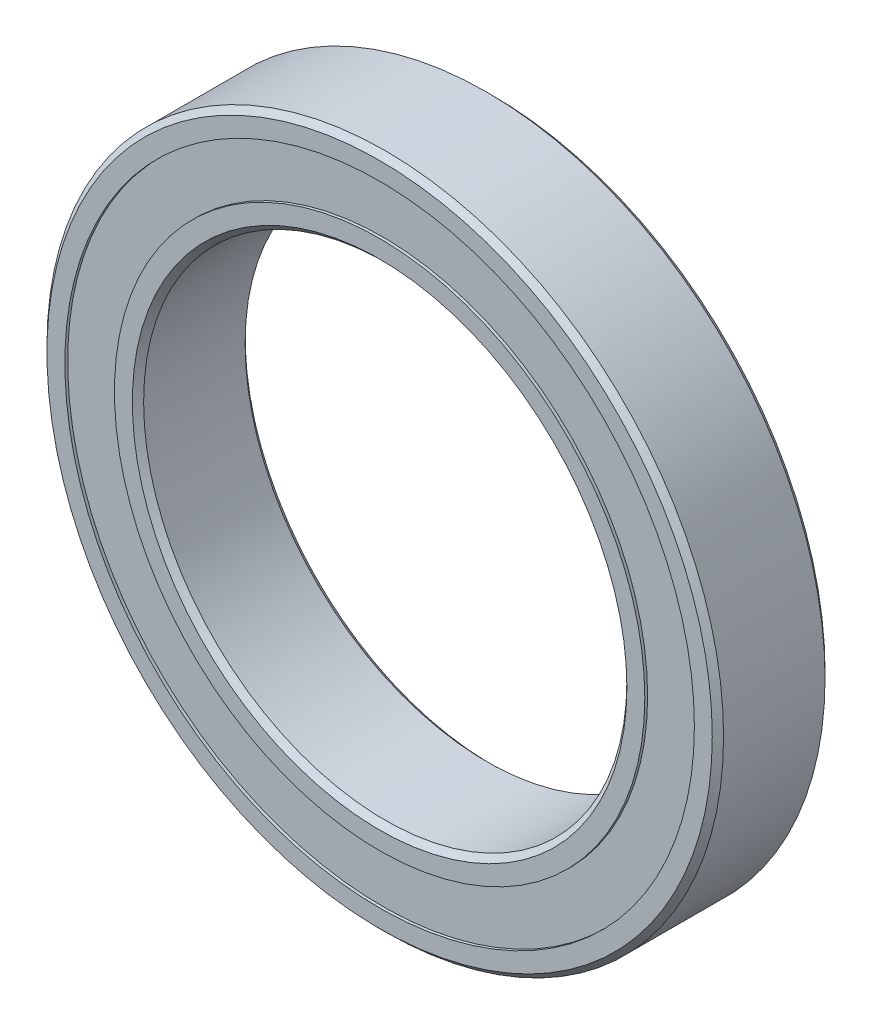
ISO-10303-21;
HEADER;
FILE_DESCRIPTION(('STEP AP214'),'2;1');
FILE_NAME('part.step','',(''),(''),'','','');
FILE_SCHEMA(('AUTOMOTIVE_DESIGN { 1 0 10303 214 1 1 1 1 }'));
ENDSEC;
DATA;
#1=APPLICATION_CONTEXT('core data for automotive mechanical design processes');
#2=APPLICATION_PROTOCOL_DEFINITION('international standard','automotive_design',2000,#1);
#3=PRODUCT_CONTEXT('',#1,'mechanical');
#4=PRODUCT('Part','Part','',(#3));
#5=PRODUCT_RELATED_PRODUCT_CATEGORY('part','',(#4));
#6=PRODUCT_DEFINITION_FORMATION('','',#4);
#7=PRODUCT_DEFINITION_CONTEXT('part definition',#1,'design');
#8=PRODUCT_DEFINITION('design','',#6,#7);
#9=PRODUCT_DEFINITION_SHAPE('','',#8);
#10=(LENGTH_UNIT() NAMED_UNIT(*) SI_UNIT(.MILLI.,.METRE.));
#11=(NAMED_UNIT(*) PLANE_ANGLE_UNIT() SI_UNIT($,.RADIAN.));
#12=(NAMED_UNIT(*) SI_UNIT($,.STERADIAN.) SOLID_ANGLE_UNIT());
#13=UNCERTAINTY_MEASURE_WITH_UNIT(LENGTH_MEASURE(1.E-05),#10,'distance_accuracy_value','');
#14=(GEOMETRIC_REPRESENTATION_CONTEXT(3) GLOBAL_UNCERTAINTY_ASSIGNED_CONTEXT((#13)) GLOBAL_UNIT_ASSIGNED_CONTEXT((#10,
#11,#12)) REPRESENTATION_CONTEXT('',''));
#15=CARTESIAN_POINT('',(0.,0.,0.));
#16=DIRECTION('',(0.,0.,1.));
#17=DIRECTION('',(1.,0.,0.));
#18=AXIS2_PLACEMENT_3D('',#15,#16,#17);
#19=CARTESIAN_POINT('',(0.,19.5384615384615,-3.32500000000001));
#20=DIRECTION('',(0.,0.,1.));
#21=DIRECTION('',(1.,0.,0.));
#22=AXIS2_PLACEMENT_3D('',#19,#20,#21);
#23=PLANE('',#22);
#24=CARTESIAN_POINT('',(0.,0.,-3.32500000000001));
#25=DIRECTION('',(0.,0.,1.));
#26=DIRECTION('',(1.,0.,0.));
#27=AXIS2_PLACEMENT_3D('',#24,#25,#26);
#28=CIRCLE('',#27,19.5384615384615);
#29=CARTESIAN_POINT('',(19.5384615384615,0.,-3.32500000000001));
#30=VERTEX_POINT('',#29);
#31=EDGE_CURVE('E55',#30,#30,#28,.T.);
#32=ORIENTED_EDGE('',*,*,#31,.F.);
#33=EDGE_LOOP('',(#32));
#34=FACE_BOUND('',#33,.T.);
#35=CARTESIAN_POINT('',(0.,0.,-3.32500000000001));
#36=DIRECTION('',(0.,0.,1.));
#37=DIRECTION('',(1.,0.,0.));
#38=AXIS2_PLACEMENT_3D('',#35,#36,#37);
#39=CIRCLE('',#38,16.4615384615385);
#40=CARTESIAN_POINT('',(16.4615384615385,0.,-3.32500000000001));
#41=VERTEX_POINT('',#40);
#42=EDGE_CURVE('E11',#41,#41,#39,.T.);
#43=ORIENTED_EDGE('',*,*,#42,.T.);
#44=EDGE_LOOP('',(#43));
#45=FACE_BOUND('',#44,.T.);
#46=ADVANCED_FACE('F41',(#34,#45),#23,.F.);
#47=CARTESIAN_POINT('',(0.,0.,3.5));
#48=DIRECTION('',(0.,0.,1.));
#49=DIRECTION('',(1.,0.,0.));
#50=AXIS2_PLACEMENT_3D('',#47,#48,#49);
#51=CYLINDRICAL_SURFACE('',#50,16.4615384615385);
#52=ORIENTED_EDGE('',*,*,#42,.F.);
#53=EDGE_LOOP('',(#52));
#54=FACE_BOUND('',#53,.T.);
#55=CARTESIAN_POINT('',(0.,0.,-2.18783385835058));
#56=DIRECTION('',(0.,0.,1.));
#57=DIRECTION('',(1.,0.,0.));
#58=AXIS2_PLACEMENT_3D('',#55,#56,#57);
#59=CIRCLE('',#58,16.4615384615385);
#60=CARTESIAN_POINT('',(16.4615384615385,0.,-2.18783385835058));
#61=VERTEX_POINT('',#60);
#62=EDGE_CURVE('E47',#61,#61,#59,.T.);
#63=ORIENTED_EDGE('',*,*,#62,.T.);
#64=EDGE_LOOP('',(#63));
#65=FACE_BOUND('',#64,.T.);
#66=ADVANCED_FACE('F64',(#54,#65),#51,.F.);
#67=CARTESIAN_POINT('',(0.,19.5384615384615,-2.18783385835058));
#68=DIRECTION('',(0.,0.,-1.));
#69=DIRECTION('',(-1.,0.,0.));
#70=AXIS2_PLACEMENT_3D('',#67,#68,#69);
#71=PLANE('',#70);
#72=ORIENTED_EDGE('',*,*,#62,.F.);
#73=EDGE_LOOP('',(#72));
#74=FACE_BOUND('',#73,.T.);
#75=CARTESIAN_POINT('',(0.,0.,-2.18783385835058));
#76=DIRECTION('',(0.,0.,1.));
#77=DIRECTION('',(1.,0.,0.));
#78=AXIS2_PLACEMENT_3D('',#75,#76,#77);
#79=CIRCLE('',#78,19.5384615384615);
#80=CARTESIAN_POINT('',(19.5384615384615,0.,-2.18783385835058));
#81=VERTEX_POINT('',#80);
#82=EDGE_CURVE('E51',#81,#81,#79,.T.);
#83=ORIENTED_EDGE('',*,*,#82,.T.);
#84=EDGE_LOOP('',(#83));
#85=FACE_BOUND('',#84,.T.);
#86=ADVANCED_FACE('F68',(#74,#85),#71,.F.);
#87=CARTESIAN_POINT('',(0.,0.,3.5));
#88=DIRECTION('',(0.,0.,1.));
#89=DIRECTION('',(1.,0.,0.));
#90=AXIS2_PLACEMENT_3D('',#87,#88,#89);
#91=CYLINDRICAL_SURFACE('',#90,19.5384615384615);
#92=ORIENTED_EDGE('',*,*,#82,.F.);
#93=EDGE_LOOP('',(#92));
#94=FACE_BOUND('',#93,.T.);
#95=ORIENTED_EDGE('',*,*,#31,.T.);
#96=EDGE_LOOP('',(#95));
#97=FACE_BOUND('',#96,.T.);
#98=ADVANCED_FACE('F61',(#94,#97),#91,.T.);
#99=CLOSED_SHELL('',(#46,#66,#86,#98));
#100=MANIFOLD_SOLID_BREP('B2',#99);
#101=CARTESIAN_POINT('',(0.,19.5384615384615,3.325));
#102=DIRECTION('',(0.,0.,-1.));
#103=DIRECTION('',(-1.,0.,0.));
#104=AXIS2_PLACEMENT_3D('',#101,#102,#103);
#105=PLANE('',#104);
#106=CARTESIAN_POINT('',(0.,0.,3.325));
#107=DIRECTION('',(0.,0.,1.));
#108=DIRECTION('',(1.,0.,0.));
#109=AXIS2_PLACEMENT_3D('',#106,#107,#108);
#110=CIRCLE('',#109,16.4615384615385);
#111=CARTESIAN_POINT('',(16.4615384615385,0.,3.325));
#112=VERTEX_POINT('',#111);
#113=EDGE_CURVE('E40',#112,#112,#110,.T.);
#114=ORIENTED_EDGE('',*,*,#113,.F.);
#115=EDGE_LOOP('',(#114));
#116=FACE_BOUND('',#115,.T.);
#117=CARTESIAN_POINT('',(0.,0.,3.325));
#118=DIRECTION('',(0.,0.,1.));
#119=DIRECTION('',(1.,0.,0.));
#120=AXIS2_PLACEMENT_3D('',#117,#118,#119);
#121=CIRCLE('',#120,19.5384615384615);
#122=CARTESIAN_POINT('',(19.5384615384615,0.,3.325));
#123=VERTEX_POINT('',#122);
#124=EDGE_CURVE('E122',#123,#123,#121,.T.);
#125=ORIENTED_EDGE('',*,*,#124,.T.);
#126=EDGE_LOOP('',(#125));
#127=FACE_BOUND('',#126,.T.);
#128=ADVANCED_FACE('F108',(#116,#127),#105,.F.);
#129=CARTESIAN_POINT('',(0.,0.,3.5));
#130=DIRECTION('',(0.,0.,1.));
#131=DIRECTION('',(1.,0.,0.));
#132=AXIS2_PLACEMENT_3D('',#129,#130,#131);
#133=CYLINDRICAL_SURFACE('',#132,16.4615384615385);
#134=CARTESIAN_POINT('',(0.,0.,2.18783385835058));
#135=DIRECTION('',(0.,0.,1.));
#136=DIRECTION('',(1.,0.,0.));
#137=AXIS2_PLACEMENT_3D('',#134,#135,#136);
#138=CIRCLE('',#137,16.4615384615385);
#139=CARTESIAN_POINT('',(16.4615384615385,0.,2.18783385835058));
#140=VERTEX_POINT('',#139);
#141=EDGE_CURVE('E114',#140,#140,#138,.T.);
#142=ORIENTED_EDGE('',*,*,#141,.F.);
#143=EDGE_LOOP('',(#142));
#144=FACE_BOUND('',#143,.T.);
#145=ORIENTED_EDGE('',*,*,#113,.T.);
#146=EDGE_LOOP('',(#145));
#147=FACE_BOUND('',#146,.T.);
#148=ADVANCED_FACE('F137',(#144,#147),#133,.F.);
#149=CARTESIAN_POINT('',(0.,19.5384615384615,2.18783385835058));
#150=DIRECTION('',(0.,0.,1.));
#151=DIRECTION('',(1.,0.,0.));
#152=AXIS2_PLACEMENT_3D('',#149,#150,#151);
#153=PLANE('',#152);
#154=CARTESIAN_POINT('',(0.,0.,2.18783385835058));
#155=DIRECTION('',(0.,0.,1.));
#156=DIRECTION('',(1.,0.,0.));
#157=AXIS2_PLACEMENT_3D('',#154,#155,#156);
#158=CIRCLE('',#157,19.5384615384615);
#159=CARTESIAN_POINT('',(19.5384615384615,0.,2.18783385835058));
#160=VERTEX_POINT('',#159);
#161=EDGE_CURVE('E118',#160,#160,#158,.T.);
#162=ORIENTED_EDGE('',*,*,#161,.F.);
#163=EDGE_LOOP('',(#162));
#164=FACE_BOUND('',#163,.T.);
#165=ORIENTED_EDGE('',*,*,#141,.T.);
#166=EDGE_LOOP('',(#165));
#167=FACE_BOUND('',#166,.T.);
#168=ADVANCED_FACE('F132',(#164,#167),#153,.F.);
#169=CARTESIAN_POINT('',(0.,0.,3.5));
#170=DIRECTION('',(0.,0.,1.));
#171=DIRECTION('',(1.,0.,0.));
#172=AXIS2_PLACEMENT_3D('',#169,#170,#171);
#173=CYLINDRICAL_SURFACE('',#172,19.5384615384615);
#174=ORIENTED_EDGE('',*,*,#124,.F.);
#175=EDGE_LOOP('',(#174));
#176=FACE_BOUND('',#175,.T.);
#177=ORIENTED_EDGE('',*,*,#161,.T.);
#178=EDGE_LOOP('',(#177));
#179=FACE_BOUND('',#178,.T.);
#180=ADVANCED_FACE('F129',(#176,#179),#173,.T.);
#181=CLOSED_SHELL('',(#128,#148,#168,#180));
#182=MANIFOLD_SOLID_BREP('B6',#181);
#183=CARTESIAN_POINT('',(-8.9999999999998,15.58845726812,0.));
#184=DIRECTION('',(0.,0.,1.));
#185=DIRECTION('',(-0.499999999999989,0.866025403784445,0.));
#186=AXIS2_PLACEMENT_3D('',#183,#184,#185);
#187=SPHERICAL_SURFACE('',#186,2.18783385835058);
#188=CARTESIAN_POINT('',(-8.9999999999998,15.58845726812,2.18783385835058));
#189=VERTEX_POINT('',#188);
#190=VERTEX_LOOP('',#189);
#191=FACE_BOUND('',#190,.T.);
#192=ADVANCED_FACE('F175',(#191),#187,.T.);
#193=CLOSED_SHELL('',(#192));
#194=MANIFOLD_SOLID_BREP('B35',#193);
#195=CARTESIAN_POINT('',(-15.5884572681198,9.00000000000018,0.));
#196=DIRECTION('',(0.,0.,1.));
#197=DIRECTION('',(-0.866025403784433,0.50000000000001,0.));
#198=AXIS2_PLACEMENT_3D('',#195,#196,#197);
#199=SPHERICAL_SURFACE('',#198,2.18783385835058);
#200=CARTESIAN_POINT('',(-15.5884572681198,9.00000000000018,2.18783385835058));
#201=VERTEX_POINT('',#200);
#202=VERTEX_LOOP('',#201);
#203=FACE_BOUND('',#202,.T.);
#204=ADVANCED_FACE('F195',(#203),#199,.T.);
#205=CLOSED_SHELL('',(#204));
#206=MANIFOLD_SOLID_BREP('B104',#205);
#207=CARTESIAN_POINT('',(-18.,1.88539992297529E-13,0.));
#208=DIRECTION('',(0.,0.,1.));
#209=DIRECTION('',(-1.,0.,0.));
#210=AXIS2_PLACEMENT_3D('',#207,#208,#209);
#211=SPHERICAL_SURFACE('',#210,2.18783385835058);
#212=CARTESIAN_POINT('',(-18.,1.88539992297529E-13,2.18783385835058));
#213=VERTEX_POINT('',#212);
#214=VERTEX_LOOP('',#213);
#215=FACE_BOUND('',#214,.T.);
#216=ADVANCED_FACE('F215',(#215),#211,.T.);
#217=CLOSED_SHELL('',(#216));
#218=MANIFOLD_SOLID_BREP('B171',#217);
#219=CARTESIAN_POINT('',(-15.58845726812,-8.99999999999986,0.));
#220=DIRECTION('',(0.,0.,1.));
#221=DIRECTION('',(-0.866025403784443,-0.499999999999992,0.));
#222=AXIS2_PLACEMENT_3D('',#219,#220,#221);
#223=SPHERICAL_SURFACE('',#222,2.18783385835058);
#224=CARTESIAN_POINT('',(-15.58845726812,-8.99999999999986,2.18783385835058));
#225=VERTEX_POINT('',#224);
#226=VERTEX_LOOP('',#225);
#227=FACE_BOUND('',#226,.T.);
#228=ADVANCED_FACE('F235',(#227),#223,.T.);
#229=CLOSED_SHELL('',(#228));
#230=MANIFOLD_SOLID_BREP('B191',#229);
#231=CARTESIAN_POINT('',(-9.00000000000013,-15.5884572681198,0.));
#232=DIRECTION('',(0.,0.,1.));
#233=DIRECTION('',(-0.500000000000007,-0.866025403784435,0.));
#234=AXIS2_PLACEMENT_3D('',#231,#232,#233);
#235=SPHERICAL_SURFACE('',#234,2.18783385835058);
#236=CARTESIAN_POINT('',(-9.00000000000013,-15.5884572681198,2.18783385835058));
#237=VERTEX_POINT('',#236);
#238=VERTEX_LOOP('',#237);
#239=FACE_BOUND('',#238,.T.);
#240=ADVANCED_FACE('F255',(#239),#235,.T.);
#241=CLOSED_SHELL('',(#240));
#242=MANIFOLD_SOLID_BREP('B211',#241);
#243=CARTESIAN_POINT('',(-1.25693328198353E-13,-18.,0.));
#244=DIRECTION('',(0.,0.,1.));
#245=DIRECTION('',(0.,-1.,0.));
#246=AXIS2_PLACEMENT_3D('',#243,#244,#245);
#247=SPHERICAL_SURFACE('',#246,2.18783385835058);
#248=CARTESIAN_POINT('',(-1.25693328198353E-13,-18.,2.18783385835058));
#249=VERTEX_POINT('',#248);
#250=VERTEX_LOOP('',#249);
#251=FACE_BOUND('',#250,.T.);
#252=ADVANCED_FACE('F275',(#251),#247,.T.);
#253=CLOSED_SHELL('',(#252));
#254=MANIFOLD_SOLID_BREP('B231',#253);
#255=CARTESIAN_POINT('',(8.99999999999991,-15.5884572681199,0.));
#256=DIRECTION('',(0.,0.,1.));
#257=DIRECTION('',(0.499999999999995,-0.866025403784442,0.));
#258=AXIS2_PLACEMENT_3D('',#255,#256,#257);
#259=SPHERICAL_SURFACE('',#258,2.18783385835058);
#260=CARTESIAN_POINT('',(8.99999999999991,-15.5884572681199,2.18783385835058));
#261=VERTEX_POINT('',#260);
#262=VERTEX_LOOP('',#261);
#263=FACE_BOUND('',#262,.T.);
#264=ADVANCED_FACE('F295',(#263),#259,.T.);
#265=CLOSED_SHELL('',(#264));
#266=MANIFOLD_SOLID_BREP('B251',#265);
#267=CARTESIAN_POINT('',(15.5884572681199,-9.00000000000008,0.));
#268=DIRECTION('',(0.,0.,1.));
#269=DIRECTION('',(0.866025403784436,-0.500000000000004,0.));
#270=AXIS2_PLACEMENT_3D('',#267,#268,#269);
#271=SPHERICAL_SURFACE('',#270,2.18783385835058);
#272=CARTESIAN_POINT('',(15.5884572681199,-9.00000000000008,2.18783385835058));
#273=VERTEX_POINT('',#272);
#274=VERTEX_LOOP('',#273);
#275=FACE_BOUND('',#274,.T.);
#276=ADVANCED_FACE('F315',(#275),#271,.T.);
#277=CLOSED_SHELL('',(#276));
#278=MANIFOLD_SOLID_BREP('B271',#277);
#279=CARTESIAN_POINT('',(18.,0.,0.));
#280=DIRECTION('',(0.,0.,1.));
#281=DIRECTION('',(1.,0.,0.));
#282=AXIS2_PLACEMENT_3D('',#279,#280,#281);
#283=SPHERICAL_SURFACE('',#282,2.18783385835058);
#284=CARTESIAN_POINT('',(18.,0.,2.18783385835058));
#285=VERTEX_POINT('',#284);
#286=VERTEX_LOOP('',#285);
#287=FACE_BOUND('',#286,.T.);
#288=ADVANCED_FACE('F335',(#287),#283,.T.);
#289=CLOSED_SHELL('',(#288));
#290=MANIFOLD_SOLID_BREP('B291',#289);
#291=CARTESIAN_POINT('',(15.5884572681199,8.99999999999996,0.));
#292=DIRECTION('',(0.,0.,1.));
#293=DIRECTION('',(0.86602540378444,0.499999999999998,0.));
#294=AXIS2_PLACEMENT_3D('',#291,#292,#293);
#295=SPHERICAL_SURFACE('',#294,2.18783385835058);
#296=CARTESIAN_POINT('',(15.5884572681199,8.99999999999996,2.18783385835058));
#297=VERTEX_POINT('',#296);
#298=VERTEX_LOOP('',#297);
#299=FACE_BOUND('',#298,.T.);
#300=ADVANCED_FACE('F355',(#299),#295,.T.);
#301=CLOSED_SHELL('',(#300));
#302=MANIFOLD_SOLID_BREP('B311',#301);
#303=CARTESIAN_POINT('',(9.00000000000002,15.5884572681199,0.));
#304=DIRECTION('',(0.,0.,1.));
#305=DIRECTION('',(0.500000000000001,0.866025403784438,0.));
#306=AXIS2_PLACEMENT_3D('',#303,#304,#305);
#307=SPHERICAL_SURFACE('',#306,2.18783385835058);
#308=CARTESIAN_POINT('',(9.00000000000002,15.5884572681199,2.18783385835058));
#309=VERTEX_POINT('',#308);
#310=VERTEX_LOOP('',#309);
#311=FACE_BOUND('',#310,.T.);
#312=ADVANCED_FACE('F375',(#311),#307,.T.);
#313=CLOSED_SHELL('',(#312));
#314=MANIFOLD_SOLID_BREP('B331',#313);
#315=CARTESIAN_POINT('',(0.,18.,0.));
#316=DIRECTION('',(0.,0.,1.));
#317=DIRECTION('',(0.,1.,0.));
#318=AXIS2_PLACEMENT_3D('',#315,#316,#317);
#319=SPHERICAL_SURFACE('',#318,2.18783385835058);
#320=CARTESIAN_POINT('',(0.,18.,2.18783385835058));
#321=VERTEX_POINT('',#320);
#322=VERTEX_LOOP('',#321);
#323=FACE_BOUND('',#322,.T.);
#324=ADVANCED_FACE('F397',(#323),#319,.T.);
#325=CLOSED_SHELL('',(#324));
#326=MANIFOLD_SOLID_BREP('B351',#325);
#327=CARTESIAN_POINT('',(0.,16.4615384615385,3.5));
#328=DIRECTION('',(0.,0.,-1.));
#329=DIRECTION('',(-1.,0.,0.));
#330=AXIS2_PLACEMENT_3D('',#327,#328,#329);
#331=PLANE('',#330);
#332=CARTESIAN_POINT('',(0.,0.,3.5));
#333=DIRECTION('',(0.,0.,1.));
#334=DIRECTION('',(1.,0.,0.));
#335=AXIS2_PLACEMENT_3D('',#332,#333,#334);
#336=CIRCLE('',#335,15.35);
#337=CARTESIAN_POINT('',(15.35,0.,3.5));
#338=VERTEX_POINT('',#337);
#339=EDGE_CURVE('E444',#338,#338,#336,.T.);
#340=ORIENTED_EDGE('',*,*,#339,.F.);
#341=EDGE_LOOP('',(#340));
#342=FACE_BOUND('',#341,.T.);
#343=CARTESIAN_POINT('',(0.,0.,3.5));
#344=DIRECTION('',(0.,0.,1.));
#345=DIRECTION('',(1.,0.,0.));
#346=AXIS2_PLACEMENT_3D('',#343,#344,#345);
#347=CIRCLE('',#346,16.4615384615385);
#348=CARTESIAN_POINT('',(16.4615384615385,0.,3.5));
#349=VERTEX_POINT('',#348);
#350=EDGE_CURVE('E396',#349,#349,#347,.T.);
#351=ORIENTED_EDGE('',*,*,#350,.T.);
#352=EDGE_LOOP('',(#351));
#353=FACE_BOUND('',#352,.T.);
#354=ADVANCED_FACE('F416',(#342,#353),#331,.F.);
#355=CARTESIAN_POINT('',(0.,0.,3.5));
#356=DIRECTION('',(0.,0.,1.));
#357=DIRECTION('',(1.,0.,0.));
#358=AXIS2_PLACEMENT_3D('',#355,#356,#357);
#359=CYLINDRICAL_SURFACE('',#358,16.4615384615385);
#360=ORIENTED_EDGE('',*,*,#350,.F.);
#361=EDGE_LOOP('',(#360));
#362=FACE_BOUND('',#361,.T.);
#363=CARTESIAN_POINT('',(0.,0.,1.55555555555556));
#364=DIRECTION('',(0.,0.,1.));
#365=DIRECTION('',(1.,0.,0.));
#366=AXIS2_PLACEMENT_3D('',#363,#364,#365);
#367=CIRCLE('',#366,16.4615384615385);
#368=CARTESIAN_POINT('',(16.4615384615385,0.,1.55555555555556));
#369=VERTEX_POINT('',#368);
#370=EDGE_CURVE('E422',#369,#369,#367,.T.);
#371=ORIENTED_EDGE('',*,*,#370,.T.);
#372=EDGE_LOOP('',(#371));
#373=FACE_BOUND('',#372,.T.);
#374=ADVANCED_FACE('F451',(#362,#373),#359,.T.);
#375=CARTESIAN_POINT('',(0.,0.,0.));
#376=DIRECTION('',(0.,0.,1.));
#377=DIRECTION('',(1.,0.,0.));
#378=AXIS2_PLACEMENT_3D('',#375,#376,#377);
#379=TOROIDAL_SURFACE('',#378,18.,2.18783385835058);
#380=ORIENTED_EDGE('',*,*,#370,.F.);
#381=EDGE_LOOP('',(#380));
#382=FACE_BOUND('',#381,.T.);
#383=CARTESIAN_POINT('',(0.,0.,-1.55555555555556));
#384=DIRECTION('',(0.,0.,1.));
#385=DIRECTION('',(1.,0.,0.));
#386=AXIS2_PLACEMENT_3D('',#383,#384,#385);
#387=CIRCLE('',#386,16.4615384615385);
#388=CARTESIAN_POINT('',(16.4615384615385,0.,-1.55555555555556));
#389=VERTEX_POINT('',#388);
#390=EDGE_CURVE('E426',#389,#389,#387,.T.);
#391=ORIENTED_EDGE('',*,*,#390,.T.);
#392=EDGE_LOOP('',(#391));
#393=FACE_BOUND('',#392,.T.);
#394=ADVANCED_FACE('F455',(#382,#393),#379,.F.);
#395=CARTESIAN_POINT('',(0.,0.,3.5));
#396=DIRECTION('',(0.,0.,1.));
#397=DIRECTION('',(1.,0.,0.));
#398=AXIS2_PLACEMENT_3D('',#395,#396,#397);
#399=CYLINDRICAL_SURFACE('',#398,16.4615384615385);
#400=ORIENTED_EDGE('',*,*,#390,.F.);
#401=EDGE_LOOP('',(#400));
#402=FACE_BOUND('',#401,.T.);
#403=CARTESIAN_POINT('',(0.,0.,-3.5));
#404=DIRECTION('',(0.,0.,1.));
#405=DIRECTION('',(1.,0.,0.));
#406=AXIS2_PLACEMENT_3D('',#403,#404,#405);
#407=CIRCLE('',#406,16.4615384615385);
#408=CARTESIAN_POINT('',(16.4615384615385,0.,-3.5));
#409=VERTEX_POINT('',#408);
#410=EDGE_CURVE('E430',#409,#409,#407,.T.);
#411=ORIENTED_EDGE('',*,*,#410,.T.);
#412=EDGE_LOOP('',(#411));
#413=FACE_BOUND('',#412,.T.);
#414=ADVANCED_FACE('F460',(#402,#413),#399,.T.);
#415=CARTESIAN_POINT('',(0.,15.35,-3.5));
#416=DIRECTION('',(0.,0.,1.));
#417=DIRECTION('',(1.,0.,0.));
#418=AXIS2_PLACEMENT_3D('',#415,#416,#417);
#419=PLANE('',#418);
#420=ORIENTED_EDGE('',*,*,#410,.F.);
#421=EDGE_LOOP('',(#420));
#422=FACE_BOUND('',#421,.T.);
#423=CARTESIAN_POINT('',(0.,0.,-3.5));
#424=DIRECTION('',(0.,0.,1.));
#425=DIRECTION('',(1.,0.,0.));
#426=AXIS2_PLACEMENT_3D('',#423,#424,#425);
#427=CIRCLE('',#426,15.35);
#428=CARTESIAN_POINT('',(15.35,0.,-3.5));
#429=VERTEX_POINT('',#428);
#430=EDGE_CURVE('E435',#429,#429,#427,.T.);
#431=ORIENTED_EDGE('',*,*,#430,.T.);
#432=EDGE_LOOP('',(#431));
#433=FACE_BOUND('',#432,.T.);
#434=ADVANCED_FACE('F466',(#422,#433),#419,.F.);
#435=CARTESIAN_POINT('',(0.,0.,-3.15));
#436=DIRECTION('',(0.,0.,-1.));
#437=DIRECTION('',(-1.,0.,0.));
#438=AXIS2_PLACEMENT_3D('',#435,#436,#437);
#439=CONICAL_SURFACE('',#438,15.,0.785398163397448);
#440=ORIENTED_EDGE('',*,*,#430,.F.);
#441=EDGE_LOOP('',(#440));
#442=FACE_BOUND('',#441,.T.);
#443=CARTESIAN_POINT('',(0.,0.,-3.15));
#444=DIRECTION('',(0.,0.,1.));
#445=DIRECTION('',(1.,0.,0.));
#446=AXIS2_PLACEMENT_3D('',#443,#444,#445);
#447=CIRCLE('',#446,15.);
#448=CARTESIAN_POINT('',(15.,0.,-3.15));
#449=VERTEX_POINT('',#448);
#450=EDGE_CURVE('E438',#449,#449,#447,.T.);
#451=ORIENTED_EDGE('',*,*,#450,.T.);
#452=EDGE_LOOP('',(#451));
#453=FACE_BOUND('',#452,.T.);
#454=ADVANCED_FACE('F470',(#442,#453),#439,.F.);
#455=CARTESIAN_POINT('',(0.,0.,3.5));
#456=DIRECTION('',(0.,0.,1.));
#457=DIRECTION('',(1.,0.,0.));
#458=AXIS2_PLACEMENT_3D('',#455,#456,#457);
#459=CYLINDRICAL_SURFACE('',#458,15.);
#460=ORIENTED_EDGE('',*,*,#450,.F.);
#461=EDGE_LOOP('',(#460));
#462=FACE_BOUND('',#461,.T.);
#463=CARTESIAN_POINT('',(0.,0.,3.15));
#464=DIRECTION('',(0.,0.,1.));
#465=DIRECTION('',(1.,0.,0.));
#466=AXIS2_PLACEMENT_3D('',#463,#464,#465);
#467=CIRCLE('',#466,15.);
#468=CARTESIAN_POINT('',(15.,0.,3.15));
#469=VERTEX_POINT('',#468);
#470=EDGE_CURVE('E441',#469,#469,#467,.T.);
#471=ORIENTED_EDGE('',*,*,#470,.T.);
#472=EDGE_LOOP('',(#471));
#473=FACE_BOUND('',#472,.T.);
#474=ADVANCED_FACE('F474',(#462,#473),#459,.F.);
#475=CARTESIAN_POINT('',(0.,0.,3.5));
#476=DIRECTION('',(0.,0.,1.));
#477=DIRECTION('',(1.,0.,0.));
#478=AXIS2_PLACEMENT_3D('',#475,#476,#477);
#479=CONICAL_SURFACE('',#478,15.35,0.785398163397448);
#480=ORIENTED_EDGE('',*,*,#470,.F.);
#481=EDGE_LOOP('',(#480));
#482=FACE_BOUND('',#481,.T.);
#483=ORIENTED_EDGE('',*,*,#339,.T.);
#484=EDGE_LOOP('',(#483));
#485=FACE_BOUND('',#484,.T.);
#486=ADVANCED_FACE('F448',(#482,#485),#479,.F.);
#487=CLOSED_SHELL('',(#354,#374,#394,#414,#434,#454,#474,#486));
#488=MANIFOLD_SOLID_BREP('B371',#487);
#489=CARTESIAN_POINT('',(0.,0.,3.15));
#490=DIRECTION('',(0.,0.,-1.));
#491=DIRECTION('',(-1.,0.,0.));
#492=AXIS2_PLACEMENT_3D('',#489,#490,#491);
#493=CONICAL_SURFACE('',#492,21.,0.785398163397448);
#494=CARTESIAN_POINT('',(0.,0.,3.5));
#495=DIRECTION('',(0.,0.,1.));
#496=DIRECTION('',(1.,0.,0.));
#497=AXIS2_PLACEMENT_3D('',#494,#495,#496);
#498=CIRCLE('',#497,20.65);
#499=CARTESIAN_POINT('',(20.65,0.,3.5));
#500=VERTEX_POINT('',#499);
#501=EDGE_CURVE('E565',#500,#500,#498,.T.);
#502=ORIENTED_EDGE('',*,*,#501,.F.);
#503=EDGE_LOOP('',(#502));
#504=FACE_BOUND('',#503,.T.);
#505=CARTESIAN_POINT('',(0.,0.,3.15));
#506=DIRECTION('',(0.,0.,1.));
#507=DIRECTION('',(1.,0.,0.));
#508=AXIS2_PLACEMENT_3D('',#505,#506,#507);
#509=CIRCLE('',#508,21.);
#510=CARTESIAN_POINT('',(21.,0.,3.15));
#511=VERTEX_POINT('',#510);
#512=EDGE_CURVE('E415',#511,#511,#509,.T.);
#513=ORIENTED_EDGE('',*,*,#512,.T.);
#514=EDGE_LOOP('',(#513));
#515=FACE_BOUND('',#514,.T.);
#516=ADVANCED_FACE('F537',(#504,#515),#493,.T.);
#517=CARTESIAN_POINT('',(0.,0.,3.5));
#518=DIRECTION('',(0.,0.,1.));
#519=DIRECTION('',(1.,0.,0.));
#520=AXIS2_PLACEMENT_3D('',#517,#518,#519);
#521=CYLINDRICAL_SURFACE('',#520,21.);
#522=ORIENTED_EDGE('',*,*,#512,.F.);
#523=EDGE_LOOP('',(#522));
#524=FACE_BOUND('',#523,.T.);
#525=CARTESIAN_POINT('',(0.,0.,-3.15));
#526=DIRECTION('',(0.,0.,1.));
#527=DIRECTION('',(1.,0.,0.));
#528=AXIS2_PLACEMENT_3D('',#525,#526,#527);
#529=CIRCLE('',#528,21.);
#530=CARTESIAN_POINT('',(21.,0.,-3.15));
#531=VERTEX_POINT('',#530);
#532=EDGE_CURVE('E543',#531,#531,#529,.T.);
#533=ORIENTED_EDGE('',*,*,#532,.T.);
#534=EDGE_LOOP('',(#533));
#535=FACE_BOUND('',#534,.T.);
#536=ADVANCED_FACE('F572',(#524,#535),#521,.T.);
#537=CARTESIAN_POINT('',(0.,0.,-3.5));
#538=DIRECTION('',(0.,0.,1.));
#539=DIRECTION('',(1.,0.,0.));
#540=AXIS2_PLACEMENT_3D('',#537,#538,#539);
#541=CONICAL_SURFACE('',#540,20.65,0.785398163397448);
#542=ORIENTED_EDGE('',*,*,#532,.F.);
#543=EDGE_LOOP('',(#542));
#544=FACE_BOUND('',#543,.T.);
#545=CARTESIAN_POINT('',(0.,0.,-3.5));
#546=DIRECTION('',(0.,0.,1.));
#547=DIRECTION('',(1.,0.,0.));
#548=AXIS2_PLACEMENT_3D('',#545,#546,#547);
#549=CIRCLE('',#548,20.65);
#550=CARTESIAN_POINT('',(20.65,0.,-3.5));
#551=VERTEX_POINT('',#550);
#552=EDGE_CURVE('E547',#551,#551,#549,.T.);
#553=ORIENTED_EDGE('',*,*,#552,.T.);
#554=EDGE_LOOP('',(#553));
#555=FACE_BOUND('',#554,.T.);
#556=ADVANCED_FACE('F576',(#544,#555),#541,.T.);
#557=CARTESIAN_POINT('',(0.,20.65,-3.5));
#558=DIRECTION('',(0.,0.,1.));
#559=DIRECTION('',(1.,0.,0.));
#560=AXIS2_PLACEMENT_3D('',#557,#558,#559);
#561=PLANE('',#560);
#562=ORIENTED_EDGE('',*,*,#552,.F.);
#563=EDGE_LOOP('',(#562));
#564=FACE_BOUND('',#563,.T.);
#565=CARTESIAN_POINT('',(0.,0.,-3.5));
#566=DIRECTION('',(0.,0.,1.));
#567=DIRECTION('',(1.,0.,0.));
#568=AXIS2_PLACEMENT_3D('',#565,#566,#567);
#569=CIRCLE('',#568,19.5384615384615);
#570=CARTESIAN_POINT('',(19.5384615384615,0.,-3.5));
#571=VERTEX_POINT('',#570);
#572=EDGE_CURVE('E551',#571,#571,#569,.T.);
#573=ORIENTED_EDGE('',*,*,#572,.T.);
#574=EDGE_LOOP('',(#573));
#575=FACE_BOUND('',#574,.T.);
#576=ADVANCED_FACE('F581',(#564,#575),#561,.F.);
#577=CARTESIAN_POINT('',(0.,0.,3.5));
#578=DIRECTION('',(0.,0.,1.));
#579=DIRECTION('',(1.,0.,0.));
#580=AXIS2_PLACEMENT_3D('',#577,#578,#579);
#581=CYLINDRICAL_SURFACE('',#580,19.5384615384615);
#582=ORIENTED_EDGE('',*,*,#572,.F.);
#583=EDGE_LOOP('',(#582));
#584=FACE_BOUND('',#583,.T.);
#585=CARTESIAN_POINT('',(0.,0.,-1.55555555555556));
#586=DIRECTION('',(0.,0.,1.));
#587=DIRECTION('',(1.,0.,0.));
#588=AXIS2_PLACEMENT_3D('',#585,#586,#587);
#589=CIRCLE('',#588,19.5384615384615);
#590=CARTESIAN_POINT('',(19.5384615384615,0.,-1.55555555555556));
#591=VERTEX_POINT('',#590);
#592=EDGE_CURVE('E556',#591,#591,#589,.T.);
#593=ORIENTED_EDGE('',*,*,#592,.T.);
#594=EDGE_LOOP('',(#593));
#595=FACE_BOUND('',#594,.T.);
#596=ADVANCED_FACE('F587',(#584,#595),#581,.F.);
#597=CARTESIAN_POINT('',(0.,0.,0.));
#598=DIRECTION('',(0.,0.,1.));
#599=DIRECTION('',(1.,0.,0.));
#600=AXIS2_PLACEMENT_3D('',#597,#598,#599);
#601=TOROIDAL_SURFACE('',#600,18.,2.18783385835058);
#602=ORIENTED_EDGE('',*,*,#592,.F.);
#603=EDGE_LOOP('',(#602));
#604=FACE_BOUND('',#603,.T.);
#605=CARTESIAN_POINT('',(0.,0.,1.55555555555556));
#606=DIRECTION('',(0.,0.,1.));
#607=DIRECTION('',(1.,0.,0.));
#608=AXIS2_PLACEMENT_3D('',#605,#606,#607);
#609=CIRCLE('',#608,19.5384615384615);
#610=CARTESIAN_POINT('',(19.5384615384615,0.,1.55555555555556));
#611=VERTEX_POINT('',#610);
#612=EDGE_CURVE('E559',#611,#611,#609,.T.);
#613=ORIENTED_EDGE('',*,*,#612,.T.);
#614=EDGE_LOOP('',(#613));
#615=FACE_BOUND('',#614,.T.);
#616=ADVANCED_FACE('F591',(#604,#615),#601,.F.);
#617=CARTESIAN_POINT('',(0.,0.,3.5));
#618=DIRECTION('',(0.,0.,1.));
#619=DIRECTION('',(1.,0.,0.));
#620=AXIS2_PLACEMENT_3D('',#617,#618,#619);
#621=CYLINDRICAL_SURFACE('',#620,19.5384615384615);
#622=ORIENTED_EDGE('',*,*,#612,.F.);
#623=EDGE_LOOP('',(#622));
#624=FACE_BOUND('',#623,.T.);
#625=CARTESIAN_POINT('',(0.,0.,3.5));
#626=DIRECTION('',(0.,0.,1.));
#627=DIRECTION('',(1.,0.,0.));
#628=AXIS2_PLACEMENT_3D('',#625,#626,#627);
#629=CIRCLE('',#628,19.5384615384615);
#630=CARTESIAN_POINT('',(19.5384615384615,0.,3.5));
#631=VERTEX_POINT('',#630);
#632=EDGE_CURVE('E562',#631,#631,#629,.T.);
#633=ORIENTED_EDGE('',*,*,#632,.T.);
#634=EDGE_LOOP('',(#633));
#635=FACE_BOUND('',#634,.T.);
#636=ADVANCED_FACE('F595',(#624,#635),#621,.F.);
#637=CARTESIAN_POINT('',(0.,20.65,3.5));
#638=DIRECTION('',(0.,0.,-1.));
#639=DIRECTION('',(-1.,0.,0.));
#640=AXIS2_PLACEMENT_3D('',#637,#638,#639);
#641=PLANE('',#640);
#642=ORIENTED_EDGE('',*,*,#632,.F.);
#643=EDGE_LOOP('',(#642));
#644=FACE_BOUND('',#643,.T.);
#645=ORIENTED_EDGE('',*,*,#501,.T.);
#646=EDGE_LOOP('',(#645));
#647=FACE_BOUND('',#646,.T.);
#648=ADVANCED_FACE('F569',(#644,#647),#641,.F.);
#649=CLOSED_SHELL('',(#516,#536,#556,#576,#596,#616,#636,#648));
#650=MANIFOLD_SOLID_BREP('B391',#649);
#651=ADVANCED_BREP_SHAPE_REPRESENTATION('',(#18,#100,#182,#194,#206,#218,#230,#242,#254,#266,
#278,#290,#302,#314,#326,#488,#650),#14);
#652=SHAPE_DEFINITION_REPRESENTATION(#9,#651);
ENDSEC;
END-ISO-10303-21;
